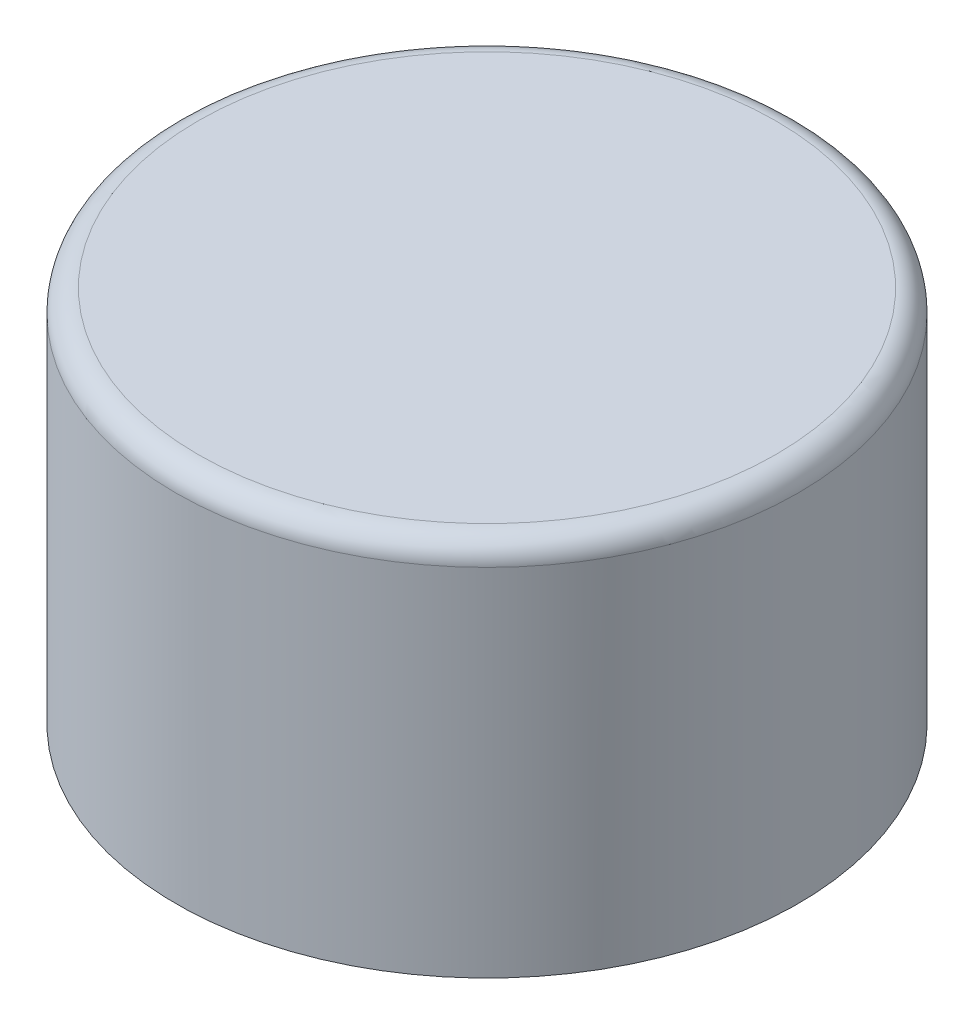
ISO-10303-21;
HEADER;
FILE_DESCRIPTION(('STEP AP214'),'2;1');
FILE_NAME('part.step','',(''),(''),'','','');
FILE_SCHEMA(('AUTOMOTIVE_DESIGN { 1 0 10303 214 1 1 1 1 }'));
ENDSEC;
DATA;
#1=APPLICATION_CONTEXT('core data for automotive mechanical design processes');
#2=APPLICATION_PROTOCOL_DEFINITION('international standard','automotive_design',2000,#1);
#3=PRODUCT_CONTEXT('',#1,'mechanical');
#4=PRODUCT('Part','Part','',(#3));
#5=PRODUCT_RELATED_PRODUCT_CATEGORY('part','',(#4));
#6=PRODUCT_DEFINITION_FORMATION('','',#4);
#7=PRODUCT_DEFINITION_CONTEXT('part definition',#1,'design');
#8=PRODUCT_DEFINITION('design','',#6,#7);
#9=PRODUCT_DEFINITION_SHAPE('','',#8);
#10=(LENGTH_UNIT() NAMED_UNIT(*) SI_UNIT(.MILLI.,.METRE.));
#11=(NAMED_UNIT(*) PLANE_ANGLE_UNIT() SI_UNIT($,.RADIAN.));
#12=(NAMED_UNIT(*) SI_UNIT($,.STERADIAN.) SOLID_ANGLE_UNIT());
#13=UNCERTAINTY_MEASURE_WITH_UNIT(LENGTH_MEASURE(1.E-05),#10,'distance_accuracy_value','');
#14=(GEOMETRIC_REPRESENTATION_CONTEXT(3) GLOBAL_UNCERTAINTY_ASSIGNED_CONTEXT((#13)) GLOBAL_UNIT_ASSIGNED_CONTEXT((#10,
#11,#12)) REPRESENTATION_CONTEXT('',''));
#15=CARTESIAN_POINT('',(0.,0.,0.));
#16=DIRECTION('',(0.,0.,1.));
#17=DIRECTION('',(1.,0.,0.));
#18=AXIS2_PLACEMENT_3D('',#15,#16,#17);
#19=CARTESIAN_POINT('',(0.,0.,0.));
#20=DIRECTION('',(0.,1.,0.));
#21=DIRECTION('',(0.,0.,1.));
#22=AXIS2_PLACEMENT_3D('',#19,#20,#21);
#23=PLANE('',#22);
#24=CARTESIAN_POINT('',(0.,0.,0.));
#25=DIRECTION('',(0.,1.,0.));
#26=DIRECTION('',(0.,0.,1.));
#27=AXIS2_PLACEMENT_3D('',#24,#25,#26);
#28=CIRCLE('',#27,12.);
#29=CARTESIAN_POINT('',(0.,0.,12.));
#30=VERTEX_POINT('',#29);
#31=EDGE_CURVE('E52',#30,#30,#28,.F.);
#32=ORIENTED_EDGE('',*,*,#31,.T.);
#33=EDGE_LOOP('',(#32));
#34=FACE_BOUND('',#33,.T.);
#35=CARTESIAN_POINT('',(0.,0.,0.));
#36=DIRECTION('',(0.,1.,0.));
#37=DIRECTION('',(0.,0.,1.));
#38=AXIS2_PLACEMENT_3D('',#35,#36,#37);
#39=CIRCLE('',#38,8.);
#40=CARTESIAN_POINT('',(0.,0.,8.));
#41=VERTEX_POINT('',#40);
#42=EDGE_CURVE('E76',#41,#41,#39,.T.);
#43=ORIENTED_EDGE('',*,*,#42,.T.);
#44=EDGE_LOOP('',(#43));
#45=FACE_BOUND('',#44,.T.);
#46=ADVANCED_FACE('F44',(#34,#45),#23,.F.);
#47=CARTESIAN_POINT('',(0.,-4.,0.));
#48=DIRECTION('',(0.,-1.,0.));
#49=DIRECTION('',(0.,0.,-1.));
#50=AXIS2_PLACEMENT_3D('',#47,#48,#49);
#51=PLANE('',#50);
#52=CARTESIAN_POINT('',(0.,-4.,0.));
#53=DIRECTION('',(0.,-1.,0.));
#54=DIRECTION('',(0.,0.,-1.));
#55=AXIS2_PLACEMENT_3D('',#52,#53,#54);
#56=CIRCLE('',#55,3.52786404500042);
#57=CARTESIAN_POINT('',(0.,-4.,-3.52786404500042));
#58=VERTEX_POINT('',#57);
#59=EDGE_CURVE('E72',#58,#58,#56,.T.);
#60=ORIENTED_EDGE('',*,*,#59,.T.);
#61=EDGE_LOOP('',(#60));
#62=FACE_BOUND('',#61,.T.);
#63=ADVANCED_FACE('F115',(#62),#51,.T.);
#64=CARTESIAN_POINT('',(0.,-16.,0.));
#65=DIRECTION('',(0.,1.,0.));
#66=DIRECTION('',(0.,0.,1.));
#67=AXIS2_PLACEMENT_3D('',#64,#65,#66);
#68=CYLINDRICAL_SURFACE('',#67,13.);
#69=CARTESIAN_POINT('',(0.,-1.,0.));
#70=DIRECTION('',(0.,1.,0.));
#71=DIRECTION('',(0.,0.,1.));
#72=AXIS2_PLACEMENT_3D('',#69,#70,#71);
#73=CIRCLE('',#72,13.);
#74=CARTESIAN_POINT('',(0.,-1.,13.));
#75=VERTEX_POINT('',#74);
#76=EDGE_CURVE('E10',#75,#75,#73,.T.);
#77=ORIENTED_EDGE('',*,*,#76,.T.);
#78=EDGE_LOOP('',(#77));
#79=FACE_BOUND('',#78,.T.);
#80=CARTESIAN_POINT('',(0.,-16.,0.));
#81=DIRECTION('',(0.,-1.,0.));
#82=DIRECTION('',(0.,0.,-1.));
#83=AXIS2_PLACEMENT_3D('',#80,#81,#82);
#84=CIRCLE('',#83,13.);
#85=CARTESIAN_POINT('',(0.,-16.,-13.));
#86=VERTEX_POINT('',#85);
#87=EDGE_CURVE('E84',#86,#86,#84,.T.);
#88=ORIENTED_EDGE('',*,*,#87,.T.);
#89=EDGE_LOOP('',(#88));
#90=FACE_BOUND('',#89,.T.);
#91=ADVANCED_FACE('F89',(#79,#90),#68,.F.);
#92=CARTESIAN_POINT('',(0.,-16.,0.));
#93=DIRECTION('',(0.,-1.,0.));
#94=DIRECTION('',(0.,0.,-1.));
#95=AXIS2_PLACEMENT_3D('',#92,#93,#94);
#96=PLANE('',#95);
#97=ORIENTED_EDGE('',*,*,#87,.F.);
#98=EDGE_LOOP('',(#97));
#99=FACE_BOUND('',#98,.T.);
#100=CARTESIAN_POINT('',(0.,-16.,0.));
#101=DIRECTION('',(0.,-1.,0.));
#102=DIRECTION('',(0.,0.,-1.));
#103=AXIS2_PLACEMENT_3D('',#100,#101,#102);
#104=CIRCLE('',#103,14.);
#105=CARTESIAN_POINT('',(0.,-16.,-14.));
#106=VERTEX_POINT('',#105);
#107=EDGE_CURVE('E80',#106,#106,#104,.T.);
#108=ORIENTED_EDGE('',*,*,#107,.T.);
#109=EDGE_LOOP('',(#108));
#110=FACE_BOUND('',#109,.T.);
#111=ADVANCED_FACE('F91',(#99,#110),#96,.T.);
#112=CARTESIAN_POINT('',(0.,1.,0.));
#113=DIRECTION('',(0.,1.,0.));
#114=DIRECTION('',(0.,0.,1.));
#115=AXIS2_PLACEMENT_3D('',#112,#113,#114);
#116=PLANE('',#115);
#117=CARTESIAN_POINT('',(0.,1.,0.));
#118=DIRECTION('',(0.,1.,0.));
#119=DIRECTION('',(0.,0.,1.));
#120=AXIS2_PLACEMENT_3D('',#117,#118,#119);
#121=CIRCLE('',#120,13.);
#122=CARTESIAN_POINT('',(0.,1.,13.));
#123=VERTEX_POINT('',#122);
#124=EDGE_CURVE('E62',#123,#123,#121,.T.);
#125=ORIENTED_EDGE('',*,*,#124,.T.);
#126=EDGE_LOOP('',(#125));
#127=FACE_BOUND('',#126,.T.);
#128=ADVANCED_FACE('F94',(#127),#116,.T.);
#129=CARTESIAN_POINT('',(0.,1.,0.));
#130=DIRECTION('',(0.,-1.,0.));
#131=DIRECTION('',(0.,0.,-1.));
#132=AXIS2_PLACEMENT_3D('',#129,#130,#131);
#133=CYLINDRICAL_SURFACE('',#132,14.);
#134=CARTESIAN_POINT('',(0.,0.,0.));
#135=DIRECTION('',(0.,1.,0.));
#136=DIRECTION('',(0.,0.,1.));
#137=AXIS2_PLACEMENT_3D('',#134,#135,#136);
#138=CIRCLE('',#137,14.);
#139=CARTESIAN_POINT('',(0.,0.,14.));
#140=VERTEX_POINT('',#139);
#141=EDGE_CURVE('E57',#140,#140,#138,.F.);
#142=ORIENTED_EDGE('',*,*,#141,.T.);
#143=EDGE_LOOP('',(#142));
#144=FACE_BOUND('',#143,.T.);
#145=ORIENTED_EDGE('',*,*,#107,.F.);
#146=EDGE_LOOP('',(#145));
#147=FACE_BOUND('',#146,.T.);
#148=ADVANCED_FACE('F98',(#144,#147),#133,.T.);
#149=CARTESIAN_POINT('',(0.,-4.,0.));
#150=DIRECTION('',(0.,1.,0.));
#151=DIRECTION('',(0.,0.,1.));
#152=AXIS2_PLACEMENT_3D('',#149,#150,#151);
#153=TOROIDAL_SURFACE('',#152,8.,4.);
#154=CARTESIAN_POINT('',(0.,-3.55555555555556,0.));
#155=DIRECTION('',(0.,-1.,0.));
#156=DIRECTION('',(0.,0.,-1.));
#157=AXIS2_PLACEMENT_3D('',#154,#155,#156);
#158=CIRCLE('',#157,4.02476804000037);
#159=CARTESIAN_POINT('',(0.,-3.55555555555556,-4.02476804000037));
#160=VERTEX_POINT('',#159);
#161=EDGE_CURVE('E68',#160,#160,#158,.F.);
#162=ORIENTED_EDGE('',*,*,#161,.T.);
#163=EDGE_LOOP('',(#162));
#164=FACE_BOUND('',#163,.T.);
#165=ORIENTED_EDGE('',*,*,#42,.F.);
#166=EDGE_LOOP('',(#165));
#167=FACE_BOUND('',#166,.T.);
#168=ADVANCED_FACE('F100',(#164,#167),#153,.F.);
#169=CARTESIAN_POINT('',(0.,-3.5,0.));
#170=DIRECTION('',(0.,1.,0.));
#171=DIRECTION('',(0.,0.,1.));
#172=AXIS2_PLACEMENT_3D('',#169,#170,#171);
#173=TOROIDAL_SURFACE('',#172,3.52786404500042,0.5);
#174=ORIENTED_EDGE('',*,*,#161,.F.);
#175=EDGE_LOOP('',(#174));
#176=FACE_BOUND('',#175,.T.);
#177=ORIENTED_EDGE('',*,*,#59,.F.);
#178=EDGE_LOOP('',(#177));
#179=FACE_BOUND('',#178,.T.);
#180=ADVANCED_FACE('F108',(#176,#179),#173,.T.);
#181=CARTESIAN_POINT('',(0.,0.,0.));
#182=DIRECTION('',(0.,1.,0.));
#183=DIRECTION('',(0.,0.,1.));
#184=AXIS2_PLACEMENT_3D('',#181,#182,#183);
#185=TOROIDAL_SURFACE('',#184,13.,1.);
#186=ORIENTED_EDGE('',*,*,#141,.F.);
#187=EDGE_LOOP('',(#186));
#188=FACE_BOUND('',#187,.T.);
#189=ORIENTED_EDGE('',*,*,#124,.F.);
#190=EDGE_LOOP('',(#189));
#191=FACE_BOUND('',#190,.T.);
#192=ADVANCED_FACE('F159',(#188,#191),#185,.T.);
#193=CARTESIAN_POINT('',(0.,-1.,0.));
#194=DIRECTION('',(0.,1.,0.));
#195=DIRECTION('',(0.,0.,1.));
#196=AXIS2_PLACEMENT_3D('',#193,#194,#195);
#197=TOROIDAL_SURFACE('',#196,12.,1.);
#198=ORIENTED_EDGE('',*,*,#76,.F.);
#199=EDGE_LOOP('',(#198));
#200=FACE_BOUND('',#199,.T.);
#201=ORIENTED_EDGE('',*,*,#31,.F.);
#202=EDGE_LOOP('',(#201));
#203=FACE_BOUND('',#202,.T.);
#204=ADVANCED_FACE('F46',(#200,#203),#197,.F.);
#205=CLOSED_SHELL('',(#46,#63,#91,#111,#128,#148,#168,#180,#192,#204));
#206=MANIFOLD_SOLID_BREP('B2',#205);
#207=ADVANCED_BREP_SHAPE_REPRESENTATION('',(#18,#206),#14);
#208=SHAPE_DEFINITION_REPRESENTATION(#9,#207);
ENDSEC;
END-ISO-10303-21;
